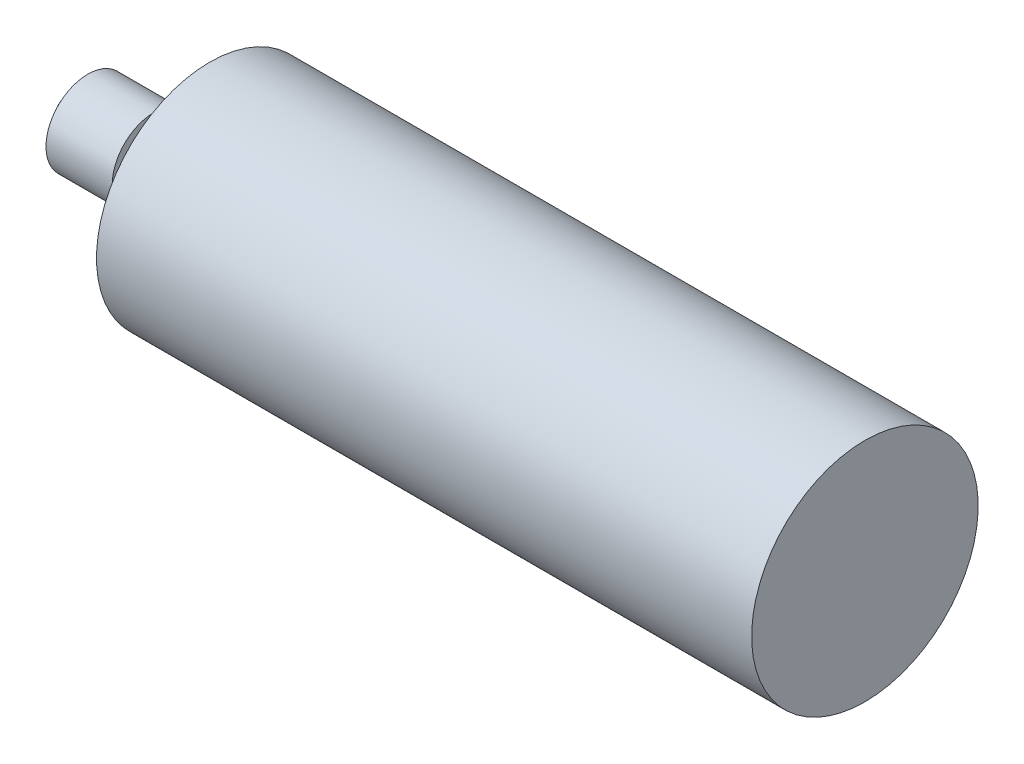
ISO-10303-21;
HEADER;
FILE_DESCRIPTION(('STEP AP214'),'2;1');
FILE_NAME('part.step','',(''),(''),'','','');
FILE_SCHEMA(('AUTOMOTIVE_DESIGN { 1 0 10303 214 1 1 1 1 }'));
ENDSEC;
DATA;
#1=APPLICATION_CONTEXT('core data for automotive mechanical design processes');
#2=APPLICATION_PROTOCOL_DEFINITION('international standard','automotive_design',2000,#1);
#3=PRODUCT_CONTEXT('',#1,'mechanical');
#4=PRODUCT('Part','Part','',(#3));
#5=PRODUCT_RELATED_PRODUCT_CATEGORY('part','',(#4));
#6=PRODUCT_DEFINITION_FORMATION('','',#4);
#7=PRODUCT_DEFINITION_CONTEXT('part definition',#1,'design');
#8=PRODUCT_DEFINITION('design','',#6,#7);
#9=PRODUCT_DEFINITION_SHAPE('','',#8);
#10=(LENGTH_UNIT() NAMED_UNIT(*) SI_UNIT(.MILLI.,.METRE.));
#11=(NAMED_UNIT(*) PLANE_ANGLE_UNIT() SI_UNIT($,.RADIAN.));
#12=(NAMED_UNIT(*) SI_UNIT($,.STERADIAN.) SOLID_ANGLE_UNIT());
#13=UNCERTAINTY_MEASURE_WITH_UNIT(LENGTH_MEASURE(1.E-05),#10,'distance_accuracy_value','');
#14=(GEOMETRIC_REPRESENTATION_CONTEXT(3) GLOBAL_UNCERTAINTY_ASSIGNED_CONTEXT((#13)) GLOBAL_UNIT_ASSIGNED_CONTEXT((#10,
#11,#12)) REPRESENTATION_CONTEXT('',''));
#15=CARTESIAN_POINT('',(0.,0.,0.));
#16=DIRECTION('',(0.,0.,1.));
#17=DIRECTION('',(1.,0.,0.));
#18=AXIS2_PLACEMENT_3D('',#15,#16,#17);
#19=CARTESIAN_POINT('',(0.,0.,0.));
#20=DIRECTION('',(-1.,0.,0.));
#21=DIRECTION('',(0.,-1.,0.));
#22=AXIS2_PLACEMENT_3D('',#19,#20,#21);
#23=PLANE('',#22);
#24=CARTESIAN_POINT('',(0.,0.,0.));
#25=DIRECTION('',(-1.,0.,0.));
#26=DIRECTION('',(0.,-1.,0.));
#27=AXIS2_PLACEMENT_3D('',#24,#25,#26);
#28=CIRCLE('',#27,5.);
#29=CARTESIAN_POINT('',(0.,-5.,0.));
#30=VERTEX_POINT('',#29);
#31=EDGE_CURVE('E10',#30,#30,#28,.T.);
#32=ORIENTED_EDGE('',*,*,#31,.F.);
#33=EDGE_LOOP('',(#32));
#34=FACE_BOUND('',#33,.T.);
#35=CARTESIAN_POINT('',(0.,0.,0.));
#36=DIRECTION('',(1.,0.,0.));
#37=DIRECTION('',(0.,1.,0.));
#38=AXIS2_PLACEMENT_3D('',#35,#36,#37);
#39=CIRCLE('',#38,12.);
#40=CARTESIAN_POINT('',(0.,12.,0.));
#41=VERTEX_POINT('',#40);
#42=EDGE_CURVE('E40',#41,#41,#39,.T.);
#43=ORIENTED_EDGE('',*,*,#42,.F.);
#44=EDGE_LOOP('',(#43));
#45=FACE_BOUND('',#44,.T.);
#46=ADVANCED_FACE('F37',(#34,#45),#23,.T.);
#47=CARTESIAN_POINT('',(223.,0.,0.));
#48=DIRECTION('',(1.,0.,0.));
#49=DIRECTION('',(0.,1.,0.));
#50=AXIS2_PLACEMENT_3D('',#47,#48,#49);
#51=CYLINDRICAL_SURFACE('',#50,12.);
#52=ORIENTED_EDGE('',*,*,#42,.T.);
#53=EDGE_LOOP('',(#52));
#54=FACE_BOUND('',#53,.T.);
#55=CARTESIAN_POINT('',(19.,0.,0.));
#56=DIRECTION('',(1.,0.,0.));
#57=DIRECTION('',(0.,1.,0.));
#58=AXIS2_PLACEMENT_3D('',#55,#56,#57);
#59=CIRCLE('',#58,12.);
#60=CARTESIAN_POINT('',(19.,12.,0.));
#61=VERTEX_POINT('',#60);
#62=EDGE_CURVE('E48',#61,#61,#59,.T.);
#63=ORIENTED_EDGE('',*,*,#62,.F.);
#64=EDGE_LOOP('',(#63));
#65=FACE_BOUND('',#64,.T.);
#66=ADVANCED_FACE('F75',(#54,#65),#51,.T.);
#67=CARTESIAN_POINT('',(19.,12.,0.));
#68=DIRECTION('',(1.,0.,0.));
#69=DIRECTION('',(0.,1.,0.));
#70=AXIS2_PLACEMENT_3D('',#67,#68,#69);
#71=PLANE('',#70);
#72=ORIENTED_EDGE('',*,*,#62,.T.);
#73=EDGE_LOOP('',(#72));
#74=FACE_BOUND('',#73,.T.);
#75=CARTESIAN_POINT('',(19.,0.,0.));
#76=DIRECTION('',(1.,0.,0.));
#77=DIRECTION('',(0.,1.,0.));
#78=AXIS2_PLACEMENT_3D('',#75,#76,#77);
#79=CIRCLE('',#78,9.);
#80=CARTESIAN_POINT('',(19.,9.,0.));
#81=VERTEX_POINT('',#80);
#82=EDGE_CURVE('E67',#81,#81,#79,.T.);
#83=ORIENTED_EDGE('',*,*,#82,.F.);
#84=EDGE_LOOP('',(#83));
#85=FACE_BOUND('',#84,.T.);
#86=ADVANCED_FACE('F72',(#74,#85),#71,.T.);
#87=CARTESIAN_POINT('',(223.,0.,0.));
#88=DIRECTION('',(1.,0.,0.));
#89=DIRECTION('',(0.,1.,0.));
#90=AXIS2_PLACEMENT_3D('',#87,#88,#89);
#91=CYLINDRICAL_SURFACE('',#90,9.);
#92=ORIENTED_EDGE('',*,*,#82,.T.);
#93=EDGE_LOOP('',(#92));
#94=FACE_BOUND('',#93,.T.);
#95=CARTESIAN_POINT('',(33.,0.,0.));
#96=DIRECTION('',(1.,0.,0.));
#97=DIRECTION('',(0.,1.,0.));
#98=AXIS2_PLACEMENT_3D('',#95,#96,#97);
#99=CIRCLE('',#98,9.);
#100=CARTESIAN_POINT('',(33.,9.,0.));
#101=VERTEX_POINT('',#100);
#102=EDGE_CURVE('E64',#101,#101,#99,.T.);
#103=ORIENTED_EDGE('',*,*,#102,.F.);
#104=EDGE_LOOP('',(#103));
#105=FACE_BOUND('',#104,.T.);
#106=ADVANCED_FACE('F82',(#94,#105),#91,.T.);
#107=CARTESIAN_POINT('',(33.,9.,0.));
#108=DIRECTION('',(-1.,0.,0.));
#109=DIRECTION('',(0.,-1.,0.));
#110=AXIS2_PLACEMENT_3D('',#107,#108,#109);
#111=PLANE('',#110);
#112=ORIENTED_EDGE('',*,*,#102,.T.);
#113=EDGE_LOOP('',(#112));
#114=FACE_BOUND('',#113,.T.);
#115=CARTESIAN_POINT('',(33.,0.,0.));
#116=DIRECTION('',(1.,0.,0.));
#117=DIRECTION('',(0.,1.,0.));
#118=AXIS2_PLACEMENT_3D('',#115,#116,#117);
#119=CIRCLE('',#118,24.);
#120=CARTESIAN_POINT('',(33.,24.,0.));
#121=VERTEX_POINT('',#120);
#122=EDGE_CURVE('E61',#121,#121,#119,.T.);
#123=ORIENTED_EDGE('',*,*,#122,.F.);
#124=EDGE_LOOP('',(#123));
#125=FACE_BOUND('',#124,.T.);
#126=ADVANCED_FACE('F88',(#114,#125),#111,.T.);
#127=CARTESIAN_POINT('',(223.,0.,0.));
#128=DIRECTION('',(1.,0.,0.));
#129=DIRECTION('',(0.,1.,0.));
#130=AXIS2_PLACEMENT_3D('',#127,#128,#129);
#131=CYLINDRICAL_SURFACE('',#130,24.);
#132=ORIENTED_EDGE('',*,*,#122,.T.);
#133=EDGE_LOOP('',(#132));
#134=FACE_BOUND('',#133,.T.);
#135=CARTESIAN_POINT('',(35.,0.,0.));
#136=DIRECTION('',(1.,0.,0.));
#137=DIRECTION('',(0.,1.,0.));
#138=AXIS2_PLACEMENT_3D('',#135,#136,#137);
#139=CIRCLE('',#138,24.);
#140=CARTESIAN_POINT('',(35.,24.,0.));
#141=VERTEX_POINT('',#140);
#142=EDGE_CURVE('E58',#141,#141,#139,.T.);
#143=ORIENTED_EDGE('',*,*,#142,.F.);
#144=EDGE_LOOP('',(#143));
#145=FACE_BOUND('',#144,.T.);
#146=ADVANCED_FACE('F92',(#134,#145),#131,.T.);
#147=CARTESIAN_POINT('',(35.,24.,0.));
#148=DIRECTION('',(-1.,0.,0.));
#149=DIRECTION('',(0.,-1.,0.));
#150=AXIS2_PLACEMENT_3D('',#147,#148,#149);
#151=PLANE('',#150);
#152=ORIENTED_EDGE('',*,*,#142,.T.);
#153=EDGE_LOOP('',(#152));
#154=FACE_BOUND('',#153,.T.);
#155=CARTESIAN_POINT('',(35.,0.,0.));
#156=DIRECTION('',(1.,0.,0.));
#157=DIRECTION('',(0.,1.,0.));
#158=AXIS2_PLACEMENT_3D('',#155,#156,#157);
#159=CIRCLE('',#158,32.5);
#160=CARTESIAN_POINT('',(35.,32.5,0.));
#161=VERTEX_POINT('',#160);
#162=EDGE_CURVE('E55',#161,#161,#159,.T.);
#163=ORIENTED_EDGE('',*,*,#162,.F.);
#164=EDGE_LOOP('',(#163));
#165=FACE_BOUND('',#164,.T.);
#166=ADVANCED_FACE('F96',(#154,#165),#151,.T.);
#167=CARTESIAN_POINT('',(223.,0.,0.));
#168=DIRECTION('',(1.,0.,0.));
#169=DIRECTION('',(0.,1.,0.));
#170=AXIS2_PLACEMENT_3D('',#167,#168,#169);
#171=CYLINDRICAL_SURFACE('',#170,32.5);
#172=ORIENTED_EDGE('',*,*,#162,.T.);
#173=EDGE_LOOP('',(#172));
#174=FACE_BOUND('',#173,.T.);
#175=CARTESIAN_POINT('',(223.,0.,0.));
#176=DIRECTION('',(1.,0.,0.));
#177=DIRECTION('',(0.,1.,0.));
#178=AXIS2_PLACEMENT_3D('',#175,#176,#177);
#179=CIRCLE('',#178,32.5);
#180=CARTESIAN_POINT('',(223.,32.5,0.));
#181=VERTEX_POINT('',#180);
#182=EDGE_CURVE('E52',#181,#181,#179,.T.);
#183=ORIENTED_EDGE('',*,*,#182,.F.);
#184=EDGE_LOOP('',(#183));
#185=FACE_BOUND('',#184,.T.);
#186=ADVANCED_FACE('F100',(#174,#185),#171,.T.);
#187=CARTESIAN_POINT('',(223.,32.5,0.));
#188=DIRECTION('',(1.,0.,0.));
#189=DIRECTION('',(0.,1.,0.));
#190=AXIS2_PLACEMENT_3D('',#187,#188,#189);
#191=PLANE('',#190);
#192=ORIENTED_EDGE('',*,*,#182,.T.);
#193=EDGE_LOOP('',(#192));
#194=FACE_BOUND('',#193,.T.);
#195=ADVANCED_FACE('F104',(#194),#191,.T.);
#196=CARTESIAN_POINT('',(-5.,0.,0.));
#197=DIRECTION('',(1.,0.,0.));
#198=DIRECTION('',(0.,1.,0.));
#199=AXIS2_PLACEMENT_3D('',#196,#197,#198);
#200=CYLINDRICAL_SURFACE('',#199,5.);
#201=CARTESIAN_POINT('',(-5.,0.,0.));
#202=DIRECTION('',(-1.,0.,0.));
#203=DIRECTION('',(0.,-1.,0.));
#204=AXIS2_PLACEMENT_3D('',#201,#202,#203);
#205=CIRCLE('',#204,5.);
#206=CARTESIAN_POINT('',(-5.,-5.,0.));
#207=VERTEX_POINT('',#206);
#208=EDGE_CURVE('E51',#207,#207,#205,.T.);
#209=ORIENTED_EDGE('',*,*,#208,.F.);
#210=EDGE_LOOP('',(#209));
#211=FACE_BOUND('',#210,.T.);
#212=ORIENTED_EDGE('',*,*,#31,.T.);
#213=EDGE_LOOP('',(#212));
#214=FACE_BOUND('',#213,.T.);
#215=ADVANCED_FACE('F108',(#211,#214),#200,.T.);
#216=CARTESIAN_POINT('',(-5.,0.,0.));
#217=DIRECTION('',(-1.,0.,0.));
#218=DIRECTION('',(0.,-1.,0.));
#219=AXIS2_PLACEMENT_3D('',#216,#217,#218);
#220=PLANE('',#219);
#221=ORIENTED_EDGE('',*,*,#208,.T.);
#222=EDGE_LOOP('',(#221));
#223=FACE_BOUND('',#222,.T.);
#224=ADVANCED_FACE('F112',(#223),#220,.T.);
#225=CLOSED_SHELL('',(#46,#66,#86,#106,#126,#146,#166,#186,#195,#215,#224));
#226=MANIFOLD_SOLID_BREP('B2',#225);
#227=ADVANCED_BREP_SHAPE_REPRESENTATION('',(#18,#226),#14);
#228=SHAPE_DEFINITION_REPRESENTATION(#9,#227);
ENDSEC;
END-ISO-10303-21;
